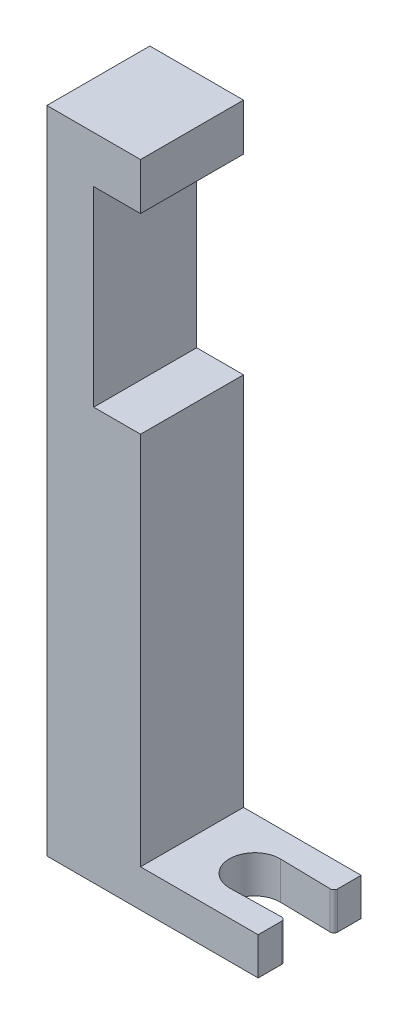
ISO-10303-21;
HEADER;
FILE_DESCRIPTION(('STEP AP214'),'2;1');
FILE_NAME('part.step','',(''),(''),'','','');
FILE_SCHEMA(('AUTOMOTIVE_DESIGN { 1 0 10303 214 1 1 1 1 }'));
ENDSEC;
DATA;
#1=APPLICATION_CONTEXT('core data for automotive mechanical design processes');
#2=APPLICATION_PROTOCOL_DEFINITION('international standard','automotive_design',2000,#1);
#3=PRODUCT_CONTEXT('',#1,'mechanical');
#4=PRODUCT('Part','Part','',(#3));
#5=PRODUCT_RELATED_PRODUCT_CATEGORY('part','',(#4));
#6=PRODUCT_DEFINITION_FORMATION('','',#4);
#7=PRODUCT_DEFINITION_CONTEXT('part definition',#1,'design');
#8=PRODUCT_DEFINITION('design','',#6,#7);
#9=PRODUCT_DEFINITION_SHAPE('','',#8);
#10=(LENGTH_UNIT() NAMED_UNIT(*) SI_UNIT(.MILLI.,.METRE.));
#11=(NAMED_UNIT(*) PLANE_ANGLE_UNIT() SI_UNIT($,.RADIAN.));
#12=(NAMED_UNIT(*) SI_UNIT($,.STERADIAN.) SOLID_ANGLE_UNIT());
#13=UNCERTAINTY_MEASURE_WITH_UNIT(LENGTH_MEASURE(1.E-05),#10,'distance_accuracy_value','');
#14=(GEOMETRIC_REPRESENTATION_CONTEXT(3) GLOBAL_UNCERTAINTY_ASSIGNED_CONTEXT((#13)) GLOBAL_UNIT_ASSIGNED_CONTEXT((#10,
#11,#12)) REPRESENTATION_CONTEXT('',''));
#15=CARTESIAN_POINT('',(0.,0.,0.));
#16=DIRECTION('',(0.,0.,1.));
#17=DIRECTION('',(1.,0.,0.));
#18=AXIS2_PLACEMENT_3D('',#15,#16,#17);
#19=CARTESIAN_POINT('',(-5.62418962934861,2.54,-13.2602199729326));
#20=DIRECTION('',(-1.,0.,0.));
#21=DIRECTION('',(0.,0.,1.));
#22=AXIS2_PLACEMENT_3D('',#19,#20,#21);
#23=PLANE('',#22);
#24=DIRECTION('',(0.,0.,-1.));
#25=VECTOR('',#24,1.);
#26=CARTESIAN_POINT('',(-5.62418962934861,0.,-13.2602199729326));
#27=LINE('',#26,#25);
#28=CARTESIAN_POINT('',(-5.62418962934861,0.,-11.6727199729326));
#29=VERTEX_POINT('',#28);
#30=CARTESIAN_POINT('',(-5.62418962934861,0.,-13.2602199729326));
#31=VERTEX_POINT('',#30);
#32=EDGE_CURVE('E151',#29,#31,#27,.T.);
#33=ORIENTED_EDGE('',*,*,#32,.T.);
#34=DIRECTION('',(0.,-1.,0.));
#35=VECTOR('',#34,1.);
#36=CARTESIAN_POINT('',(-5.62418962934861,2.54,-13.2602199729326));
#37=LINE('',#36,#35);
#38=CARTESIAN_POINT('',(-5.62418962934861,2.54,-13.2602199729326));
#39=VERTEX_POINT('',#38);
#40=EDGE_CURVE('E11',#39,#31,#37,.T.);
#41=ORIENTED_EDGE('',*,*,#40,.F.);
#42=DIRECTION('',(0.,0.,-1.));
#43=VECTOR('',#42,1.);
#44=CARTESIAN_POINT('',(-5.62418962934861,2.54,-13.2602199729326));
#45=LINE('',#44,#43);
#46=CARTESIAN_POINT('',(-5.62418962934861,2.54,-11.6727199729326));
#47=VERTEX_POINT('',#46);
#48=EDGE_CURVE('E171',#47,#39,#45,.T.);
#49=ORIENTED_EDGE('',*,*,#48,.F.);
#50=DIRECTION('',(0.,-1.,0.));
#51=VECTOR('',#50,1.);
#52=CARTESIAN_POINT('',(-5.62418962934861,2.54,-11.6727199729326));
#53=LINE('',#52,#51);
#54=EDGE_CURVE('E150',#47,#29,#53,.T.);
#55=ORIENTED_EDGE('',*,*,#54,.T.);
#56=EDGE_LOOP('',(#33,#41,#49,#55));
#57=FACE_BOUND('',#56,.T.);
#58=ADVANCED_FACE('F33',(#57),#23,.F.);
#59=CARTESIAN_POINT('',(-5.87818962934861,2.54,-13.2602199729326));
#60=DIRECTION('',(0.,-1.,0.));
#61=DIRECTION('',(0.,0.,-1.));
#62=AXIS2_PLACEMENT_3D('',#59,#60,#61);
#63=CYLINDRICAL_SURFACE('',#62,0.254);
#64=CARTESIAN_POINT('',(-5.87818962934861,0.,-13.2602199729326));
#65=DIRECTION('',(0.,1.,0.));
#66=DIRECTION('',(0.,0.,-1.));
#67=AXIS2_PLACEMENT_3D('',#64,#65,#66);
#68=CIRCLE('',#67,0.254);
#69=CARTESIAN_POINT('',(-5.88306973688024,0.,-13.5141730877993));
#70=VERTEX_POINT('',#69);
#71=EDGE_CURVE('E154',#31,#70,#68,.T.);
#72=ORIENTED_EDGE('',*,*,#71,.T.);
#73=DIRECTION('',(0.,-1.,0.));
#74=VECTOR('',#73,1.);
#75=CARTESIAN_POINT('',(-5.88306973688024,2.54,-13.5141730877993));
#76=LINE('',#75,#74);
#77=CARTESIAN_POINT('',(-5.88306973688024,2.54,-13.5141730877993));
#78=VERTEX_POINT('',#77);
#79=EDGE_CURVE('E40',#78,#70,#76,.T.);
#80=ORIENTED_EDGE('',*,*,#79,.F.);
#81=CARTESIAN_POINT('',(-5.87818962934861,2.54,-13.2602199729326));
#82=DIRECTION('',(0.,1.,0.));
#83=DIRECTION('',(0.,0.,-1.));
#84=AXIS2_PLACEMENT_3D('',#81,#82,#83);
#85=CIRCLE('',#84,0.254);
#86=EDGE_CURVE('E103',#39,#78,#85,.T.);
#87=ORIENTED_EDGE('',*,*,#86,.F.);
#88=ORIENTED_EDGE('',*,*,#40,.T.);
#89=EDGE_LOOP('',(#72,#80,#87,#88));
#90=FACE_BOUND('',#89,.T.);
#91=ADVANCED_FACE('F322',(#90),#63,.T.);
#92=CARTESIAN_POINT('',(-9.31143678758017,2.54,-13.4482916361222));
#93=DIRECTION('',(0.0192130217781098,0.,0.999815412860871));
#94=DIRECTION('',(0.999815412860871,0.,-0.0192130217781098));
#95=AXIS2_PLACEMENT_3D('',#92,#93,#94);
#96=PLANE('',#95);
#97=DIRECTION('',(-0.999815412860871,0.,0.0192130217781098));
#98=VECTOR('',#97,1.);
#99=CARTESIAN_POINT('',(-9.31143678758017,0.,-13.4482916361222));
#100=LINE('',#99,#98);
#101=CARTESIAN_POINT('',(-9.31143678758017,0.,-13.4482916361222));
#102=VERTEX_POINT('',#101);
#103=EDGE_CURVE('E157',#70,#102,#100,.T.);
#104=ORIENTED_EDGE('',*,*,#103,.T.);
#105=DIRECTION('',(0.,-1.,0.));
#106=VECTOR('',#105,1.);
#107=CARTESIAN_POINT('',(-9.31143678758017,2.54,-13.4482916361222));
#108=LINE('',#107,#106);
#109=CARTESIAN_POINT('',(-9.31143678758017,2.54,-13.4482916361222));
#110=VERTEX_POINT('',#109);
#111=EDGE_CURVE('E183',#110,#102,#108,.T.);
#112=ORIENTED_EDGE('',*,*,#111,.F.);
#113=DIRECTION('',(-0.999815412860871,0.,0.0192130217781098));
#114=VECTOR('',#113,1.);
#115=CARTESIAN_POINT('',(-9.31143678758017,2.54,-13.4482916361222));
#116=LINE('',#115,#114);
#117=EDGE_CURVE('E191',#78,#110,#116,.T.);
#118=ORIENTED_EDGE('',*,*,#117,.F.);
#119=ORIENTED_EDGE('',*,*,#79,.T.);
#120=EDGE_LOOP('',(#104,#112,#118,#119));
#121=FACE_BOUND('',#120,.T.);
#122=ADVANCED_FACE('F189',(#121),#96,.F.);
#123=CARTESIAN_POINT('',(-9.34438359497565,2.54,-15.1627916361222));
#124=DIRECTION('',(0.,-1.,0.));
#125=DIRECTION('',(0.,0.,-1.));
#126=AXIS2_PLACEMENT_3D('',#123,#124,#125);
#127=CYLINDRICAL_SURFACE('',#126,1.71481653307797);
#128=CARTESIAN_POINT('',(-9.34438359497565,0.,-15.1627916361222));
#129=DIRECTION('',(0.,-1.,0.));
#130=DIRECTION('',(0.,0.,1.));
#131=AXIS2_PLACEMENT_3D('',#128,#129,#130);
#132=CIRCLE('',#131,1.71481653307797);
#133=CARTESIAN_POINT('',(-9.31143678758017,0.,-16.8772916361222));
#134=VERTEX_POINT('',#133);
#135=EDGE_CURVE('E159',#102,#134,#132,.T.);
#136=ORIENTED_EDGE('',*,*,#135,.T.);
#137=DIRECTION('',(0.,-1.,0.));
#138=VECTOR('',#137,1.);
#139=CARTESIAN_POINT('',(-9.31143678758017,2.54,-16.8772916361222));
#140=LINE('',#139,#138);
#141=CARTESIAN_POINT('',(-9.31143678758017,2.54,-16.8772916361222));
#142=VERTEX_POINT('',#141);
#143=EDGE_CURVE('E180',#142,#134,#140,.T.);
#144=ORIENTED_EDGE('',*,*,#143,.F.);
#145=CARTESIAN_POINT('',(-9.34438359497565,2.54,-15.1627916361222));
#146=DIRECTION('',(0.,-1.,0.));
#147=DIRECTION('',(0.,0.,1.));
#148=AXIS2_PLACEMENT_3D('',#145,#146,#147);
#149=CIRCLE('',#148,1.71481653307797);
#150=EDGE_CURVE('E203',#110,#142,#149,.T.);
#151=ORIENTED_EDGE('',*,*,#150,.F.);
#152=ORIENTED_EDGE('',*,*,#111,.T.);
#153=EDGE_LOOP('',(#136,#144,#151,#152));
#154=FACE_BOUND('',#153,.T.);
#155=ADVANCED_FACE('F199',(#154),#127,.F.);
#156=CARTESIAN_POINT('',(-5.88306973688025,2.54,-16.811410184445));
#157=DIRECTION('',(0.0192130217781093,0.,-0.999815412860871));
#158=DIRECTION('',(-0.999815412860871,0.,-0.0192130217781093));
#159=AXIS2_PLACEMENT_3D('',#156,#157,#158);
#160=PLANE('',#159);
#161=DIRECTION('',(0.999815412860871,0.,0.0192130217781093));
#162=VECTOR('',#161,1.);
#163=CARTESIAN_POINT('',(-5.88306973688025,0.,-16.811410184445));
#164=LINE('',#163,#162);
#165=CARTESIAN_POINT('',(-5.88306973688025,0.,-16.811410184445));
#166=VERTEX_POINT('',#165);
#167=EDGE_CURVE('E161',#134,#166,#164,.T.);
#168=ORIENTED_EDGE('',*,*,#167,.T.);
#169=DIRECTION('',(0.,-1.,0.));
#170=VECTOR('',#169,1.);
#171=CARTESIAN_POINT('',(-5.88306973688025,2.54,-16.811410184445));
#172=LINE('',#171,#170);
#173=CARTESIAN_POINT('',(-5.88306973688025,2.54,-16.811410184445));
#174=VERTEX_POINT('',#173);
#175=EDGE_CURVE('E138',#174,#166,#172,.T.);
#176=ORIENTED_EDGE('',*,*,#175,.F.);
#177=DIRECTION('',(0.999815412860871,0.,0.0192130217781093));
#178=VECTOR('',#177,1.);
#179=CARTESIAN_POINT('',(-5.88306973688025,2.54,-16.811410184445));
#180=LINE('',#179,#178);
#181=EDGE_CURVE('E126',#142,#174,#180,.T.);
#182=ORIENTED_EDGE('',*,*,#181,.F.);
#183=ORIENTED_EDGE('',*,*,#143,.T.);
#184=EDGE_LOOP('',(#168,#176,#182,#183));
#185=FACE_BOUND('',#184,.T.);
#186=ADVANCED_FACE('F202',(#185),#160,.F.);
#187=CARTESIAN_POINT('',(-5.87818962934861,2.54,-17.0653632993117));
#188=DIRECTION('',(0.,-1.,0.));
#189=DIRECTION('',(0.,0.,-1.));
#190=AXIS2_PLACEMENT_3D('',#187,#188,#189);
#191=CYLINDRICAL_SURFACE('',#190,0.254000000000001);
#192=CARTESIAN_POINT('',(-5.87818962934861,0.,-17.0653632993117));
#193=DIRECTION('',(0.,1.,0.));
#194=DIRECTION('',(0.,0.,-1.));
#195=AXIS2_PLACEMENT_3D('',#192,#193,#194);
#196=CIRCLE('',#195,0.254000000000001);
#197=CARTESIAN_POINT('',(-5.6241896293486,0.,-17.0653632993117));
#198=VERTEX_POINT('',#197);
#199=EDGE_CURVE('E135',#166,#198,#196,.T.);
#200=ORIENTED_EDGE('',*,*,#199,.T.);
#201=DIRECTION('',(0.,-1.,0.));
#202=VECTOR('',#201,1.);
#203=CARTESIAN_POINT('',(-5.6241896293486,2.54,-17.0653632993117));
#204=LINE('',#203,#202);
#205=CARTESIAN_POINT('',(-5.6241896293486,2.54,-17.0653632993117));
#206=VERTEX_POINT('',#205);
#207=EDGE_CURVE('E132',#206,#198,#204,.T.);
#208=ORIENTED_EDGE('',*,*,#207,.F.);
#209=CARTESIAN_POINT('',(-5.87818962934861,2.54,-17.0653632993117));
#210=DIRECTION('',(0.,1.,0.));
#211=DIRECTION('',(0.,0.,-1.));
#212=AXIS2_PLACEMENT_3D('',#209,#210,#211);
#213=CIRCLE('',#212,0.254000000000001);
#214=EDGE_CURVE('E118',#174,#206,#213,.T.);
#215=ORIENTED_EDGE('',*,*,#214,.F.);
#216=ORIENTED_EDGE('',*,*,#175,.T.);
#217=EDGE_LOOP('',(#200,#208,#215,#216));
#218=FACE_BOUND('',#217,.T.);
#219=ADVANCED_FACE('F133',(#218),#191,.T.);
#220=CARTESIAN_POINT('',(-5.6241896293486,2.54,-18.6528632993117));
#221=DIRECTION('',(-1.,0.,0.));
#222=DIRECTION('',(0.,0.,1.));
#223=AXIS2_PLACEMENT_3D('',#220,#221,#222);
#224=PLANE('',#223);
#225=DIRECTION('',(0.,0.,-1.));
#226=VECTOR('',#225,1.);
#227=CARTESIAN_POINT('',(-5.6241896293486,0.,-18.6528632993117));
#228=LINE('',#227,#226);
#229=CARTESIAN_POINT('',(-5.6241896293486,0.,-18.6528632993117));
#230=VERTEX_POINT('',#229);
#231=EDGE_CURVE('E164',#198,#230,#228,.T.);
#232=ORIENTED_EDGE('',*,*,#231,.T.);
#233=DIRECTION('',(0.,-1.,0.));
#234=VECTOR('',#233,1.);
#235=CARTESIAN_POINT('',(-5.6241896293486,2.54,-18.6528632993117));
#236=LINE('',#235,#234);
#237=CARTESIAN_POINT('',(-5.6241896293486,2.54,-18.6528632993117));
#238=VERTEX_POINT('',#237);
#239=EDGE_CURVE('E139',#238,#230,#236,.T.);
#240=ORIENTED_EDGE('',*,*,#239,.F.);
#241=DIRECTION('',(0.,0.,-1.));
#242=VECTOR('',#241,1.);
#243=CARTESIAN_POINT('',(-5.6241896293486,2.54,-18.6528632993117));
#244=LINE('',#243,#242);
#245=EDGE_CURVE('E123',#206,#238,#244,.T.);
#246=ORIENTED_EDGE('',*,*,#245,.F.);
#247=ORIENTED_EDGE('',*,*,#207,.T.);
#248=EDGE_LOOP('',(#232,#240,#246,#247));
#249=FACE_BOUND('',#248,.T.);
#250=ADVANCED_FACE('F141',(#249),#224,.F.);
#251=CARTESIAN_POINT('',(-19.9492001280536,2.54,-18.6528632993117));
#252=DIRECTION('',(0.,0.,1.));
#253=DIRECTION('',(1.,0.,0.));
#254=AXIS2_PLACEMENT_3D('',#251,#252,#253);
#255=PLANE('',#254);
#256=DIRECTION('',(-1.,0.,0.));
#257=VECTOR('',#256,1.);
#258=CARTESIAN_POINT('',(-19.9492001280536,0.,-18.6528632993117));
#259=LINE('',#258,#257);
#260=CARTESIAN_POINT('',(-19.9492001280536,0.,-18.6528632993117));
#261=VERTEX_POINT('',#260);
#262=EDGE_CURVE('E166',#230,#261,#259,.T.);
#263=ORIENTED_EDGE('',*,*,#262,.T.);
#264=DIRECTION('',(0.,-1.,0.));
#265=VECTOR('',#264,1.);
#266=CARTESIAN_POINT('',(-19.9492001280536,2.54,-18.6528632993117));
#267=LINE('',#266,#265);
#268=CARTESIAN_POINT('',(-19.9492001280536,44.069,-18.6528632993117));
#269=VERTEX_POINT('',#268);
#270=EDGE_CURVE('E175',#269,#261,#267,.T.);
#271=ORIENTED_EDGE('',*,*,#270,.F.);
#272=DIRECTION('',(1.,0.,0.));
#273=VECTOR('',#272,1.);
#274=CARTESIAN_POINT('',(-19.9492001280536,44.069,-18.6528632993117));
#275=LINE('',#274,#273);
#276=CARTESIAN_POINT('',(-13.5992001280536,44.069,-18.6528632993117));
#277=VERTEX_POINT('',#276);
#278=EDGE_CURVE('E211',#269,#277,#275,.T.);
#279=ORIENTED_EDGE('',*,*,#278,.T.);
#280=DIRECTION('',(0.,-1.,0.));
#281=VECTOR('',#280,1.);
#282=CARTESIAN_POINT('',(-13.5992001280536,44.069,-18.6528632993117));
#283=LINE('',#282,#281);
#284=CARTESIAN_POINT('',(-13.5992001280536,40.894,-18.6528632993117));
#285=VERTEX_POINT('',#284);
#286=EDGE_CURVE('E250',#277,#285,#283,.T.);
#287=ORIENTED_EDGE('',*,*,#286,.T.);
#288=DIRECTION('',(-1.,0.,0.));
#289=VECTOR('',#288,1.);
#290=CARTESIAN_POINT('',(-13.5992001280536,40.894,-18.6528632993117));
#291=LINE('',#290,#289);
#292=CARTESIAN_POINT('',(-16.7742001280536,40.894,-18.6528632993117));
#293=VERTEX_POINT('',#292);
#294=EDGE_CURVE('E253',#285,#293,#291,.T.);
#295=ORIENTED_EDGE('',*,*,#294,.T.);
#296=DIRECTION('',(0.,-1.,0.));
#297=VECTOR('',#296,1.);
#298=CARTESIAN_POINT('',(-16.7742001280536,40.894,-18.6528632993117));
#299=LINE('',#298,#297);
#300=CARTESIAN_POINT('',(-16.7742001280536,27.94,-18.6528632993117));
#301=VERTEX_POINT('',#300);
#302=EDGE_CURVE('E256',#293,#301,#299,.T.);
#303=ORIENTED_EDGE('',*,*,#302,.T.);
#304=DIRECTION('',(1.,0.,0.));
#305=VECTOR('',#304,1.);
#306=CARTESIAN_POINT('',(-16.7742001280536,27.94,-18.6528632993117));
#307=LINE('',#306,#305);
#308=CARTESIAN_POINT('',(-13.5992001280536,27.94,-18.6528632993117));
#309=VERTEX_POINT('',#308);
#310=EDGE_CURVE('E232',#301,#309,#307,.T.);
#311=ORIENTED_EDGE('',*,*,#310,.T.);
#312=DIRECTION('',(0.,-1.,0.));
#313=VECTOR('',#312,1.);
#314=CARTESIAN_POINT('',(-13.5992001280536,27.94,-18.6528632993117));
#315=LINE('',#314,#313);
#316=CARTESIAN_POINT('',(-13.5992001280536,2.54,-18.6528632993117));
#317=VERTEX_POINT('',#316);
#318=EDGE_CURVE('E155',#309,#317,#315,.T.);
#319=ORIENTED_EDGE('',*,*,#318,.T.);
#320=DIRECTION('',(-1.,0.,0.));
#321=VECTOR('',#320,1.);
#322=CARTESIAN_POINT('',(-19.9492001280536,2.54,-18.6528632993117));
#323=LINE('',#322,#321);
#324=EDGE_CURVE('E144',#238,#317,#323,.T.);
#325=ORIENTED_EDGE('',*,*,#324,.F.);
#326=ORIENTED_EDGE('',*,*,#239,.T.);
#327=EDGE_LOOP('',(#263,#271,#279,#287,#295,#303,#311,#319,#325,#326));
#328=FACE_BOUND('',#327,.T.);
#329=ADVANCED_FACE('F264',(#328),#255,.F.);
#330=CARTESIAN_POINT('',(-19.9492001280536,2.54,-11.6727199729326));
#331=DIRECTION('',(1.,0.,0.));
#332=DIRECTION('',(0.,0.,-1.));
#333=AXIS2_PLACEMENT_3D('',#330,#331,#332);
#334=PLANE('',#333);
#335=DIRECTION('',(0.,0.,1.));
#336=VECTOR('',#335,1.);
#337=CARTESIAN_POINT('',(-19.9492001280536,0.,-11.6727199729326));
#338=LINE('',#337,#336);
#339=CARTESIAN_POINT('',(-19.9492001280536,0.,-11.6727199729326));
#340=VERTEX_POINT('',#339);
#341=EDGE_CURVE('E168',#261,#340,#338,.T.);
#342=ORIENTED_EDGE('',*,*,#341,.T.);
#343=DIRECTION('',(0.,-1.,0.));
#344=VECTOR('',#343,1.);
#345=CARTESIAN_POINT('',(-19.9492001280536,2.54,-11.6727199729326));
#346=LINE('',#345,#344);
#347=CARTESIAN_POINT('',(-19.9492001280536,44.069,-11.6727199729326));
#348=VERTEX_POINT('',#347);
#349=EDGE_CURVE('E173',#348,#340,#346,.T.);
#350=ORIENTED_EDGE('',*,*,#349,.F.);
#351=DIRECTION('',(0.,0.,1.));
#352=VECTOR('',#351,1.);
#353=CARTESIAN_POINT('',(-19.9492001280536,44.069,-60.6645324044544));
#354=LINE('',#353,#352);
#355=EDGE_CURVE('E229',#269,#348,#354,.T.);
#356=ORIENTED_EDGE('',*,*,#355,.F.);
#357=ORIENTED_EDGE('',*,*,#270,.T.);
#358=EDGE_LOOP('',(#342,#350,#356,#357));
#359=FACE_BOUND('',#358,.T.);
#360=ADVANCED_FACE('F283',(#359),#334,.F.);
#361=CARTESIAN_POINT('',(-5.62418962934861,2.54,-11.6727199729326));
#362=DIRECTION('',(0.,0.,-1.));
#363=DIRECTION('',(-1.,0.,0.));
#364=AXIS2_PLACEMENT_3D('',#361,#362,#363);
#365=PLANE('',#364);
#366=DIRECTION('',(1.,0.,0.));
#367=VECTOR('',#366,1.);
#368=CARTESIAN_POINT('',(-5.62418962934861,0.,-11.6727199729326));
#369=LINE('',#368,#367);
#370=EDGE_CURVE('E95',#340,#29,#369,.T.);
#371=ORIENTED_EDGE('',*,*,#370,.T.);
#372=ORIENTED_EDGE('',*,*,#54,.F.);
#373=DIRECTION('',(1.,0.,0.));
#374=VECTOR('',#373,1.);
#375=CARTESIAN_POINT('',(-5.62418962934861,2.54,-11.6727199729326));
#376=LINE('',#375,#374);
#377=CARTESIAN_POINT('',(-13.5992001280536,2.54,-11.6727199729326));
#378=VERTEX_POINT('',#377);
#379=EDGE_CURVE('E55',#378,#47,#376,.T.);
#380=ORIENTED_EDGE('',*,*,#379,.F.);
#381=DIRECTION('',(0.,1.,0.));
#382=VECTOR('',#381,1.);
#383=CARTESIAN_POINT('',(-13.5992001280536,27.94,-11.6727199729326));
#384=LINE('',#383,#382);
#385=CARTESIAN_POINT('',(-13.5992001280536,27.94,-11.6727199729326));
#386=VERTEX_POINT('',#385);
#387=EDGE_CURVE('E47',#378,#386,#384,.T.);
#388=ORIENTED_EDGE('',*,*,#387,.T.);
#389=DIRECTION('',(-1.,0.,0.));
#390=VECTOR('',#389,1.);
#391=CARTESIAN_POINT('',(-16.7742001280536,27.94,-11.6727199729326));
#392=LINE('',#391,#390);
#393=CARTESIAN_POINT('',(-16.7742001280536,27.94,-11.6727199729326));
#394=VERTEX_POINT('',#393);
#395=EDGE_CURVE('E244',#386,#394,#392,.T.);
#396=ORIENTED_EDGE('',*,*,#395,.T.);
#397=DIRECTION('',(0.,1.,0.));
#398=VECTOR('',#397,1.);
#399=CARTESIAN_POINT('',(-16.7742001280536,40.894,-11.6727199729326));
#400=LINE('',#399,#398);
#401=CARTESIAN_POINT('',(-16.7742001280536,40.894,-11.6727199729326));
#402=VERTEX_POINT('',#401);
#403=EDGE_CURVE('E241',#394,#402,#400,.T.);
#404=ORIENTED_EDGE('',*,*,#403,.T.);
#405=DIRECTION('',(1.,0.,0.));
#406=VECTOR('',#405,1.);
#407=CARTESIAN_POINT('',(-13.5992001280536,40.894,-11.6727199729326));
#408=LINE('',#407,#406);
#409=CARTESIAN_POINT('',(-13.5992001280536,40.894,-11.6727199729326));
#410=VERTEX_POINT('',#409);
#411=EDGE_CURVE('E238',#402,#410,#408,.T.);
#412=ORIENTED_EDGE('',*,*,#411,.T.);
#413=DIRECTION('',(0.,1.,0.));
#414=VECTOR('',#413,1.);
#415=CARTESIAN_POINT('',(-13.5992001280536,44.069,-11.6727199729326));
#416=LINE('',#415,#414);
#417=CARTESIAN_POINT('',(-13.5992001280536,44.069,-11.6727199729326));
#418=VERTEX_POINT('',#417);
#419=EDGE_CURVE('E235',#410,#418,#416,.T.);
#420=ORIENTED_EDGE('',*,*,#419,.T.);
#421=DIRECTION('',(-1.,0.,0.));
#422=VECTOR('',#421,1.);
#423=CARTESIAN_POINT('',(-19.9492001280536,44.069,-11.6727199729326));
#424=LINE('',#423,#422);
#425=EDGE_CURVE('E215',#418,#348,#424,.T.);
#426=ORIENTED_EDGE('',*,*,#425,.T.);
#427=ORIENTED_EDGE('',*,*,#349,.T.);
#428=EDGE_LOOP('',(#371,#372,#380,#388,#396,#404,#412,#420,#426,#427));
#429=FACE_BOUND('',#428,.T.);
#430=ADVANCED_FACE('F285',(#429),#365,.F.);
#431=CARTESIAN_POINT('',(-5.87818962934861,2.54,-17.0653632993117));
#432=DIRECTION('',(0.,-1.,0.));
#433=DIRECTION('',(0.,0.,-1.));
#434=AXIS2_PLACEMENT_3D('',#431,#432,#433);
#435=PLANE('',#434);
#436=ORIENTED_EDGE('',*,*,#324,.T.);
#437=DIRECTION('',(0.,0.,1.));
#438=VECTOR('',#437,1.);
#439=CARTESIAN_POINT('',(-13.5992001280536,2.54,-60.6645324044544));
#440=LINE('',#439,#438);
#441=EDGE_CURVE('E212',#317,#378,#440,.T.);
#442=ORIENTED_EDGE('',*,*,#441,.T.);
#443=ORIENTED_EDGE('',*,*,#379,.T.);
#444=ORIENTED_EDGE('',*,*,#48,.T.);
#445=ORIENTED_EDGE('',*,*,#86,.T.);
#446=ORIENTED_EDGE('',*,*,#117,.T.);
#447=ORIENTED_EDGE('',*,*,#150,.T.);
#448=ORIENTED_EDGE('',*,*,#181,.T.);
#449=ORIENTED_EDGE('',*,*,#214,.T.);
#450=ORIENTED_EDGE('',*,*,#245,.T.);
#451=EDGE_LOOP('',(#436,#442,#443,#444,#445,#446,#447,#448,#449,#450));
#452=FACE_BOUND('',#451,.T.);
#453=ADVANCED_FACE('F121',(#452),#435,.F.);
#454=CARTESIAN_POINT('',(-5.87818962934861,0.,-17.0653632993117));
#455=DIRECTION('',(0.,-1.,0.));
#456=DIRECTION('',(0.,0.,-1.));
#457=AXIS2_PLACEMENT_3D('',#454,#455,#456);
#458=PLANE('',#457);
#459=ORIENTED_EDGE('',*,*,#32,.F.);
#460=ORIENTED_EDGE('',*,*,#370,.F.);
#461=ORIENTED_EDGE('',*,*,#341,.F.);
#462=ORIENTED_EDGE('',*,*,#262,.F.);
#463=ORIENTED_EDGE('',*,*,#231,.F.);
#464=ORIENTED_EDGE('',*,*,#199,.F.);
#465=ORIENTED_EDGE('',*,*,#167,.F.);
#466=ORIENTED_EDGE('',*,*,#135,.F.);
#467=ORIENTED_EDGE('',*,*,#103,.F.);
#468=ORIENTED_EDGE('',*,*,#71,.F.);
#469=EDGE_LOOP('',(#459,#460,#461,#462,#463,#464,#465,#466,#467,#468));
#470=FACE_BOUND('',#469,.T.);
#471=ADVANCED_FACE('F195',(#470),#458,.T.);
#472=CARTESIAN_POINT('',(-19.9492001280536,44.069,-60.6645324044544));
#473=DIRECTION('',(0.,1.,0.));
#474=DIRECTION('',(0.,0.,1.));
#475=AXIS2_PLACEMENT_3D('',#472,#473,#474);
#476=PLANE('',#475);
#477=ORIENTED_EDGE('',*,*,#278,.F.);
#478=ORIENTED_EDGE('',*,*,#355,.T.);
#479=ORIENTED_EDGE('',*,*,#425,.F.);
#480=DIRECTION('',(0.,0.,1.));
#481=VECTOR('',#480,1.);
#482=CARTESIAN_POINT('',(-13.5992001280536,44.069,-60.6645324044544));
#483=LINE('',#482,#481);
#484=EDGE_CURVE('E226',#277,#418,#483,.T.);
#485=ORIENTED_EDGE('',*,*,#484,.F.);
#486=EDGE_LOOP('',(#477,#478,#479,#485));
#487=FACE_BOUND('',#486,.T.);
#488=ADVANCED_FACE('F293',(#487),#476,.T.);
#489=CARTESIAN_POINT('',(-13.5992001280536,44.069,-60.6645324044544));
#490=DIRECTION('',(1.,0.,0.));
#491=DIRECTION('',(0.,0.,-1.));
#492=AXIS2_PLACEMENT_3D('',#489,#490,#491);
#493=PLANE('',#492);
#494=ORIENTED_EDGE('',*,*,#286,.F.);
#495=ORIENTED_EDGE('',*,*,#484,.T.);
#496=ORIENTED_EDGE('',*,*,#419,.F.);
#497=DIRECTION('',(0.,0.,1.));
#498=VECTOR('',#497,1.);
#499=CARTESIAN_POINT('',(-13.5992001280536,40.894,-60.6645324044544));
#500=LINE('',#499,#498);
#501=EDGE_CURVE('E223',#285,#410,#500,.T.);
#502=ORIENTED_EDGE('',*,*,#501,.F.);
#503=EDGE_LOOP('',(#494,#495,#496,#502));
#504=FACE_BOUND('',#503,.T.);
#505=ADVANCED_FACE('F356',(#504),#493,.T.);
#506=CARTESIAN_POINT('',(-13.5992001280536,40.894,-60.6645324044544));
#507=DIRECTION('',(0.,-1.,0.));
#508=DIRECTION('',(0.,0.,-1.));
#509=AXIS2_PLACEMENT_3D('',#506,#507,#508);
#510=PLANE('',#509);
#511=ORIENTED_EDGE('',*,*,#294,.F.);
#512=ORIENTED_EDGE('',*,*,#501,.T.);
#513=ORIENTED_EDGE('',*,*,#411,.F.);
#514=DIRECTION('',(0.,0.,1.));
#515=VECTOR('',#514,1.);
#516=CARTESIAN_POINT('',(-16.7742001280536,40.894,-60.6645324044544));
#517=LINE('',#516,#515);
#518=EDGE_CURVE('E220',#293,#402,#517,.T.);
#519=ORIENTED_EDGE('',*,*,#518,.F.);
#520=EDGE_LOOP('',(#511,#512,#513,#519));
#521=FACE_BOUND('',#520,.T.);
#522=ADVANCED_FACE('F315',(#521),#510,.T.);
#523=CARTESIAN_POINT('',(-16.7742001280536,40.894,-60.6645324044544));
#524=DIRECTION('',(1.,0.,0.));
#525=DIRECTION('',(0.,0.,-1.));
#526=AXIS2_PLACEMENT_3D('',#523,#524,#525);
#527=PLANE('',#526);
#528=ORIENTED_EDGE('',*,*,#302,.F.);
#529=ORIENTED_EDGE('',*,*,#518,.T.);
#530=ORIENTED_EDGE('',*,*,#403,.F.);
#531=DIRECTION('',(0.,0.,1.));
#532=VECTOR('',#531,1.);
#533=CARTESIAN_POINT('',(-16.7742001280536,27.94,-60.6645324044544));
#534=LINE('',#533,#532);
#535=EDGE_CURVE('E217',#301,#394,#534,.T.);
#536=ORIENTED_EDGE('',*,*,#535,.F.);
#537=EDGE_LOOP('',(#528,#529,#530,#536));
#538=FACE_BOUND('',#537,.T.);
#539=ADVANCED_FACE('F312',(#538),#527,.T.);
#540=CARTESIAN_POINT('',(-16.7742001280536,27.94,-60.6645324044544));
#541=DIRECTION('',(0.,1.,0.));
#542=DIRECTION('',(0.,0.,1.));
#543=AXIS2_PLACEMENT_3D('',#540,#541,#542);
#544=PLANE('',#543);
#545=ORIENTED_EDGE('',*,*,#310,.F.);
#546=ORIENTED_EDGE('',*,*,#535,.T.);
#547=ORIENTED_EDGE('',*,*,#395,.F.);
#548=DIRECTION('',(0.,0.,1.));
#549=VECTOR('',#548,1.);
#550=CARTESIAN_POINT('',(-13.5992001280536,27.94,-60.6645324044544));
#551=LINE('',#550,#549);
#552=EDGE_CURVE('E214',#309,#386,#551,.T.);
#553=ORIENTED_EDGE('',*,*,#552,.F.);
#554=EDGE_LOOP('',(#545,#546,#547,#553));
#555=FACE_BOUND('',#554,.T.);
#556=ADVANCED_FACE('F273',(#555),#544,.T.);
#557=CARTESIAN_POINT('',(-13.5992001280536,27.94,-60.6645324044544));
#558=DIRECTION('',(1.,0.,0.));
#559=DIRECTION('',(0.,0.,-1.));
#560=AXIS2_PLACEMENT_3D('',#557,#558,#559);
#561=PLANE('',#560);
#562=ORIENTED_EDGE('',*,*,#318,.F.);
#563=ORIENTED_EDGE('',*,*,#552,.T.);
#564=ORIENTED_EDGE('',*,*,#387,.F.);
#565=ORIENTED_EDGE('',*,*,#441,.F.);
#566=EDGE_LOOP('',(#562,#563,#564,#565));
#567=FACE_BOUND('',#566,.T.);
#568=ADVANCED_FACE('F275',(#567),#561,.T.);
#569=CLOSED_SHELL('',(#58,#91,#122,#155,#186,#219,#250,#329,#360,#430,#453,#471,#488,#505,#522,
#539,#556,#568));
#570=MANIFOLD_SOLID_BREP('B2',#569);
#571=ADVANCED_BREP_SHAPE_REPRESENTATION('',(#18,#570),#14);
#572=SHAPE_DEFINITION_REPRESENTATION(#9,#571);
ENDSEC;
END-ISO-10303-21;
